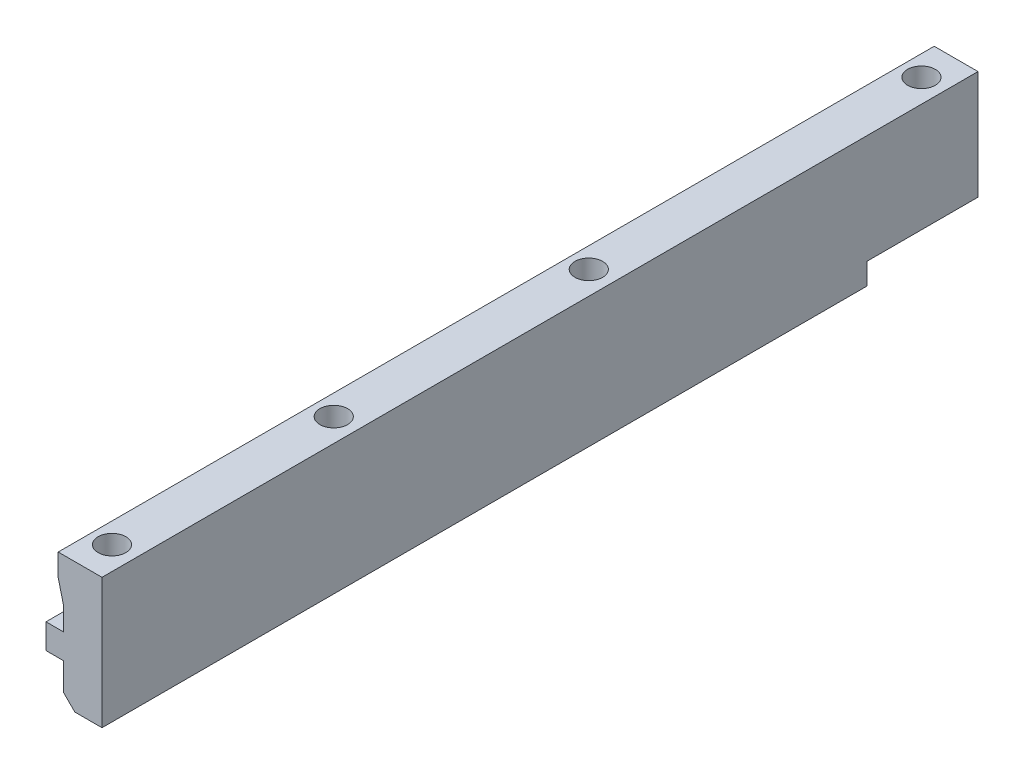
ISO-10303-21;
HEADER;
FILE_DESCRIPTION(('STEP AP214'),'2;1');
FILE_NAME('part.step','',(''),(''),'','','');
FILE_SCHEMA(('AUTOMOTIVE_DESIGN { 1 0 10303 214 1 1 1 1 }'));
ENDSEC;
DATA;
#1=APPLICATION_CONTEXT('core data for automotive mechanical design processes');
#2=APPLICATION_PROTOCOL_DEFINITION('international standard','automotive_design',2000,#1);
#3=PRODUCT_CONTEXT('',#1,'mechanical');
#4=PRODUCT('Part','Part','',(#3));
#5=PRODUCT_RELATED_PRODUCT_CATEGORY('part','',(#4));
#6=PRODUCT_DEFINITION_FORMATION('','',#4);
#7=PRODUCT_DEFINITION_CONTEXT('part definition',#1,'design');
#8=PRODUCT_DEFINITION('design','',#6,#7);
#9=PRODUCT_DEFINITION_SHAPE('','',#8);
#10=(LENGTH_UNIT() NAMED_UNIT(*) SI_UNIT(.MILLI.,.METRE.));
#11=(NAMED_UNIT(*) PLANE_ANGLE_UNIT() SI_UNIT($,.RADIAN.));
#12=(NAMED_UNIT(*) SI_UNIT($,.STERADIAN.) SOLID_ANGLE_UNIT());
#13=UNCERTAINTY_MEASURE_WITH_UNIT(LENGTH_MEASURE(1.E-05),#10,'distance_accuracy_value','');
#14=(GEOMETRIC_REPRESENTATION_CONTEXT(3) GLOBAL_UNCERTAINTY_ASSIGNED_CONTEXT((#13)) GLOBAL_UNIT_ASSIGNED_CONTEXT((#10,
#11,#12)) REPRESENTATION_CONTEXT('',''));
#15=CARTESIAN_POINT('',(0.,0.,0.));
#16=DIRECTION('',(0.,0.,1.));
#17=DIRECTION('',(1.,0.,0.));
#18=AXIS2_PLACEMENT_3D('',#15,#16,#17);
#19=CARTESIAN_POINT('',(0.,0.,0.));
#20=DIRECTION('',(0.,0.,1.));
#21=DIRECTION('',(-1.,0.,0.));
#22=AXIS2_PLACEMENT_3D('',#19,#20,#21);
#23=PLANE('',#22);
#24=DIRECTION('',(0.,-1.,0.));
#25=VECTOR('',#24,1.);
#26=CARTESIAN_POINT('',(-45.4,0.,0.));
#27=LINE('',#26,#25);
#28=CARTESIAN_POINT('',(-45.4,2.25,0.));
#29=VERTEX_POINT('',#28);
#30=CARTESIAN_POINT('',(-45.4,-2.25,0.));
#31=VERTEX_POINT('',#30);
#32=EDGE_CURVE('E210',#29,#31,#27,.T.);
#33=ORIENTED_EDGE('',*,*,#32,.T.);
#34=DIRECTION('',(1.,0.,0.));
#35=VECTOR('',#34,1.);
#36=CARTESIAN_POINT('',(-45.4,-2.25,0.));
#37=LINE('',#36,#35);
#38=CARTESIAN_POINT('',(-48.6,-2.25,0.));
#39=VERTEX_POINT('',#38);
#40=EDGE_CURVE('E201',#39,#31,#37,.T.);
#41=ORIENTED_EDGE('',*,*,#40,.F.);
#42=DIRECTION('',(0.,-1.,0.));
#43=VECTOR('',#42,1.);
#44=CARTESIAN_POINT('',(-48.6,-2.25,0.));
#45=LINE('',#44,#43);
#46=CARTESIAN_POINT('',(-48.6,2.25,0.));
#47=VERTEX_POINT('',#46);
#48=EDGE_CURVE('E198',#47,#39,#45,.T.);
#49=ORIENTED_EDGE('',*,*,#48,.F.);
#50=DIRECTION('',(-1.,0.,0.));
#51=VECTOR('',#50,1.);
#52=CARTESIAN_POINT('',(-48.6,2.25,0.));
#53=LINE('',#52,#51);
#54=EDGE_CURVE('E164',#29,#47,#53,.T.);
#55=ORIENTED_EDGE('',*,*,#54,.F.);
#56=EDGE_LOOP('',(#33,#41,#49,#55));
#57=FACE_BOUND('',#56,.T.);
#58=ADVANCED_FACE('F37',(#57),#23,.F.);
#59=CARTESIAN_POINT('',(-38.5,14.25,138.));
#60=DIRECTION('',(1.,0.,0.));
#61=DIRECTION('',(0.,0.,1.));
#62=AXIS2_PLACEMENT_3D('',#59,#60,#61);
#63=PLANE('',#62);
#64=DIRECTION('',(0.,1.,0.));
#65=VECTOR('',#64,1.);
#66=CARTESIAN_POINT('',(-38.5,14.25,0.));
#67=LINE('',#66,#65);
#68=CARTESIAN_POINT('',(-38.5,-9.25,0.));
#69=VERTEX_POINT('',#68);
#70=CARTESIAN_POINT('',(-38.5,-5.37654590485204,0.));
#71=VERTEX_POINT('',#70);
#72=EDGE_CURVE('E161',#69,#71,#67,.T.);
#73=ORIENTED_EDGE('',*,*,#72,.T.);
#74=DIRECTION('',(0.,0.,1.));
#75=VECTOR('',#74,1.);
#76=CARTESIAN_POINT('',(-38.5,-5.37654590485204,-20.));
#77=LINE('',#76,#75);
#78=CARTESIAN_POINT('',(-38.5,-5.37654590485204,-20.));
#79=VERTEX_POINT('',#78);
#80=EDGE_CURVE('E142',#79,#71,#77,.T.);
#81=ORIENTED_EDGE('',*,*,#80,.F.);
#82=DIRECTION('',(0.,1.,0.));
#83=VECTOR('',#82,1.);
#84=CARTESIAN_POINT('',(-38.5,0.,-20.));
#85=LINE('',#84,#83);
#86=CARTESIAN_POINT('',(-38.5,14.25,-20.));
#87=VERTEX_POINT('',#86);
#88=EDGE_CURVE('E146',#79,#87,#85,.T.);
#89=ORIENTED_EDGE('',*,*,#88,.T.);
#90=DIRECTION('',(0.,0.,-1.));
#91=VECTOR('',#90,1.);
#92=CARTESIAN_POINT('',(-38.5,14.25,138.));
#93=LINE('',#92,#91);
#94=CARTESIAN_POINT('',(-38.5,14.25,138.));
#95=VERTEX_POINT('',#94);
#96=EDGE_CURVE('E194',#95,#87,#93,.T.);
#97=ORIENTED_EDGE('',*,*,#96,.F.);
#98=DIRECTION('',(0.,1.,0.));
#99=VECTOR('',#98,1.);
#100=CARTESIAN_POINT('',(-38.5,14.25,138.));
#101=LINE('',#100,#99);
#102=CARTESIAN_POINT('',(-38.5,-9.25,138.));
#103=VERTEX_POINT('',#102);
#104=EDGE_CURVE('E172',#103,#95,#101,.T.);
#105=ORIENTED_EDGE('',*,*,#104,.F.);
#106=DIRECTION('',(0.,0.,-1.));
#107=VECTOR('',#106,1.);
#108=CARTESIAN_POINT('',(-38.5,-9.25,138.));
#109=LINE('',#108,#107);
#110=EDGE_CURVE('E208',#103,#69,#109,.T.);
#111=ORIENTED_EDGE('',*,*,#110,.T.);
#112=EDGE_LOOP('',(#73,#81,#89,#97,#105,#111));
#113=FACE_BOUND('',#112,.T.);
#114=ADVANCED_FACE('F158',(#113),#63,.T.);
#115=CARTESIAN_POINT('',(-38.5,-9.25,138.));
#116=DIRECTION('',(0.,-1.,0.));
#117=DIRECTION('',(0.,0.,1.));
#118=AXIS2_PLACEMENT_3D('',#115,#116,#117);
#119=PLANE('',#118);
#120=DIRECTION('',(1.,0.,0.));
#121=VECTOR('',#120,1.);
#122=CARTESIAN_POINT('',(-38.5,-9.25,0.));
#123=LINE('',#122,#121);
#124=CARTESIAN_POINT('',(-43.4,-9.25,0.));
#125=VERTEX_POINT('',#124);
#126=EDGE_CURVE('E176',#125,#69,#123,.T.);
#127=ORIENTED_EDGE('',*,*,#126,.T.);
#128=ORIENTED_EDGE('',*,*,#110,.F.);
#129=DIRECTION('',(1.,0.,0.));
#130=VECTOR('',#129,1.);
#131=CARTESIAN_POINT('',(-38.5,-9.25,138.));
#132=LINE('',#131,#130);
#133=CARTESIAN_POINT('',(-43.4,-9.25,138.));
#134=VERTEX_POINT('',#133);
#135=EDGE_CURVE('E193',#134,#103,#132,.T.);
#136=ORIENTED_EDGE('',*,*,#135,.F.);
#137=DIRECTION('',(0.,0.,1.));
#138=VECTOR('',#137,1.);
#139=CARTESIAN_POINT('',(-43.4,-9.25,138.));
#140=LINE('',#139,#138);
#141=EDGE_CURVE('E238',#125,#134,#140,.T.);
#142=ORIENTED_EDGE('',*,*,#141,.F.);
#143=EDGE_LOOP('',(#127,#128,#136,#142));
#144=FACE_BOUND('',#143,.T.);
#145=ADVANCED_FACE('F256',(#144),#119,.T.);
#146=CARTESIAN_POINT('',(-45.4,-9.25,138.));
#147=DIRECTION('',(-1.,0.,0.));
#148=DIRECTION('',(0.,-1.,0.));
#149=AXIS2_PLACEMENT_3D('',#146,#147,#148);
#150=PLANE('',#149);
#151=DIRECTION('',(0.,-1.,0.));
#152=VECTOR('',#151,1.);
#153=CARTESIAN_POINT('',(-45.4,-9.25,0.));
#154=LINE('',#153,#152);
#155=CARTESIAN_POINT('',(-45.4,-3.37654590485205,0.));
#156=VERTEX_POINT('',#155);
#157=CARTESIAN_POINT('',(-45.4,-7.25000000000001,0.));
#158=VERTEX_POINT('',#157);
#159=EDGE_CURVE('E204',#156,#158,#154,.T.);
#160=ORIENTED_EDGE('',*,*,#159,.T.);
#161=DIRECTION('',(0.,0.,-1.));
#162=VECTOR('',#161,1.);
#163=CARTESIAN_POINT('',(-45.4,-7.25000000000001,138.));
#164=LINE('',#163,#162);
#165=CARTESIAN_POINT('',(-45.4,-7.25000000000001,138.));
#166=VERTEX_POINT('',#165);
#167=EDGE_CURVE('E230',#166,#158,#164,.T.);
#168=ORIENTED_EDGE('',*,*,#167,.F.);
#169=DIRECTION('',(0.,-1.,0.));
#170=VECTOR('',#169,1.);
#171=CARTESIAN_POINT('',(-45.4,-9.25,138.));
#172=LINE('',#171,#170);
#173=CARTESIAN_POINT('',(-45.4,-2.25,138.));
#174=VERTEX_POINT('',#173);
#175=EDGE_CURVE('E191',#174,#166,#172,.T.);
#176=ORIENTED_EDGE('',*,*,#175,.F.);
#177=DIRECTION('',(0.,0.,-1.));
#178=VECTOR('',#177,1.);
#179=CARTESIAN_POINT('',(-45.4,-2.25,138.));
#180=LINE('',#179,#178);
#181=EDGE_CURVE('E211',#174,#31,#180,.T.);
#182=ORIENTED_EDGE('',*,*,#181,.T.);
#183=ORIENTED_EDGE('',*,*,#32,.F.);
#184=DIRECTION('',(0.,0.,-1.));
#185=VECTOR('',#184,1.);
#186=CARTESIAN_POINT('',(-45.4,2.25,138.));
#187=LINE('',#186,#185);
#188=CARTESIAN_POINT('',(-45.4,2.25,138.));
#189=VERTEX_POINT('',#188);
#190=EDGE_CURVE('E217',#189,#29,#187,.T.);
#191=ORIENTED_EDGE('',*,*,#190,.F.);
#192=DIRECTION('',(0.,-1.,0.));
#193=VECTOR('',#192,1.);
#194=CARTESIAN_POINT('',(-45.4,2.25,138.));
#195=LINE('',#194,#193);
#196=CARTESIAN_POINT('',(-45.4,6.25,138.));
#197=VERTEX_POINT('',#196);
#198=EDGE_CURVE('E182',#197,#189,#195,.T.);
#199=ORIENTED_EDGE('',*,*,#198,.F.);
#200=DIRECTION('',(0.,0.,-1.));
#201=VECTOR('',#200,1.);
#202=CARTESIAN_POINT('',(-45.4,6.25,138.));
#203=LINE('',#202,#201);
#204=CARTESIAN_POINT('',(-45.4,6.25,-20.));
#205=VERTEX_POINT('',#204);
#206=EDGE_CURVE('E219',#197,#205,#203,.T.);
#207=ORIENTED_EDGE('',*,*,#206,.T.);
#208=DIRECTION('',(0.,-1.,0.));
#209=VECTOR('',#208,1.);
#210=CARTESIAN_POINT('',(-45.4,0.,-20.));
#211=LINE('',#210,#209);
#212=CARTESIAN_POINT('',(-45.4,-3.37654590485205,-20.));
#213=VERTEX_POINT('',#212);
#214=EDGE_CURVE('E147',#205,#213,#211,.T.);
#215=ORIENTED_EDGE('',*,*,#214,.T.);
#216=DIRECTION('',(0.,0.,-1.));
#217=VECTOR('',#216,1.);
#218=CARTESIAN_POINT('',(-45.4,-3.37654590485205,138.));
#219=LINE('',#218,#217);
#220=EDGE_CURVE('E232',#156,#213,#219,.T.);
#221=ORIENTED_EDGE('',*,*,#220,.F.);
#222=EDGE_LOOP('',(#160,#168,#176,#182,#183,#191,#199,#207,#215,#221));
#223=FACE_BOUND('',#222,.T.);
#224=ADVANCED_FACE('F246',(#223),#150,.T.);
#225=CARTESIAN_POINT('',(-45.4,-2.25,138.));
#226=DIRECTION('',(0.,-1.,0.));
#227=DIRECTION('',(0.,0.,1.));
#228=AXIS2_PLACEMENT_3D('',#225,#226,#227);
#229=PLANE('',#228);
#230=ORIENTED_EDGE('',*,*,#40,.T.);
#231=ORIENTED_EDGE('',*,*,#181,.F.);
#232=DIRECTION('',(1.,0.,0.));
#233=VECTOR('',#232,1.);
#234=CARTESIAN_POINT('',(-45.4,-2.25,138.));
#235=LINE('',#234,#233);
#236=CARTESIAN_POINT('',(-48.6,-2.25,138.));
#237=VERTEX_POINT('',#236);
#238=EDGE_CURVE('E189',#237,#174,#235,.T.);
#239=ORIENTED_EDGE('',*,*,#238,.F.);
#240=DIRECTION('',(0.,0.,-1.));
#241=VECTOR('',#240,1.);
#242=CARTESIAN_POINT('',(-48.6,-2.25,138.));
#243=LINE('',#242,#241);
#244=EDGE_CURVE('E213',#237,#39,#243,.T.);
#245=ORIENTED_EDGE('',*,*,#244,.T.);
#246=EDGE_LOOP('',(#230,#231,#239,#245));
#247=FACE_BOUND('',#246,.T.);
#248=ADVANCED_FACE('F286',(#247),#229,.T.);
#249=CARTESIAN_POINT('',(-48.6,-2.25,138.));
#250=DIRECTION('',(-1.,0.,0.));
#251=DIRECTION('',(0.,0.,-1.));
#252=AXIS2_PLACEMENT_3D('',#249,#250,#251);
#253=PLANE('',#252);
#254=ORIENTED_EDGE('',*,*,#48,.T.);
#255=ORIENTED_EDGE('',*,*,#244,.F.);
#256=DIRECTION('',(0.,-1.,0.));
#257=VECTOR('',#256,1.);
#258=CARTESIAN_POINT('',(-48.6,-2.25,138.));
#259=LINE('',#258,#257);
#260=CARTESIAN_POINT('',(-48.6,2.25,138.));
#261=VERTEX_POINT('',#260);
#262=EDGE_CURVE('E187',#261,#237,#259,.T.);
#263=ORIENTED_EDGE('',*,*,#262,.F.);
#264=DIRECTION('',(0.,0.,-1.));
#265=VECTOR('',#264,1.);
#266=CARTESIAN_POINT('',(-48.6,2.25,138.));
#267=LINE('',#266,#265);
#268=EDGE_CURVE('E215',#261,#47,#267,.T.);
#269=ORIENTED_EDGE('',*,*,#268,.T.);
#270=EDGE_LOOP('',(#254,#255,#263,#269));
#271=FACE_BOUND('',#270,.T.);
#272=ADVANCED_FACE('F283',(#271),#253,.T.);
#273=CARTESIAN_POINT('',(-48.6,2.25,138.));
#274=DIRECTION('',(0.,1.,0.));
#275=DIRECTION('',(0.,0.,-1.));
#276=AXIS2_PLACEMENT_3D('',#273,#274,#275);
#277=PLANE('',#276);
#278=ORIENTED_EDGE('',*,*,#54,.T.);
#279=ORIENTED_EDGE('',*,*,#268,.F.);
#280=DIRECTION('',(-1.,0.,0.));
#281=VECTOR('',#280,1.);
#282=CARTESIAN_POINT('',(-48.6,2.25,138.));
#283=LINE('',#282,#281);
#284=EDGE_CURVE('E185',#189,#261,#283,.T.);
#285=ORIENTED_EDGE('',*,*,#284,.F.);
#286=ORIENTED_EDGE('',*,*,#190,.T.);
#287=EDGE_LOOP('',(#278,#279,#285,#286));
#288=FACE_BOUND('',#287,.T.);
#289=ADVANCED_FACE('F277',(#288),#277,.T.);
#290=CARTESIAN_POINT('',(-46.4,10.25,138.));
#291=DIRECTION('',(-0.970142500145332,-0.242535625036333,0.));
#292=DIRECTION('',(0.242535625036333,-0.970142500145332,0.));
#293=AXIS2_PLACEMENT_3D('',#290,#291,#292);
#294=PLANE('',#293);
#295=ORIENTED_EDGE('',*,*,#206,.F.);
#296=DIRECTION('',(0.242535625036333,-0.970142500145332,0.));
#297=VECTOR('',#296,1.);
#298=CARTESIAN_POINT('',(-46.4,10.25,138.));
#299=LINE('',#298,#297);
#300=CARTESIAN_POINT('',(-46.4,10.25,138.));
#301=VERTEX_POINT('',#300);
#302=EDGE_CURVE('E180',#301,#197,#299,.T.);
#303=ORIENTED_EDGE('',*,*,#302,.F.);
#304=DIRECTION('',(0.,0.,-1.));
#305=VECTOR('',#304,1.);
#306=CARTESIAN_POINT('',(-46.4,10.25,138.));
#307=LINE('',#306,#305);
#308=CARTESIAN_POINT('',(-46.4,10.25,-20.));
#309=VERTEX_POINT('',#308);
#310=EDGE_CURVE('E222',#301,#309,#307,.T.);
#311=ORIENTED_EDGE('',*,*,#310,.T.);
#312=DIRECTION('',(0.242535625036333,-0.970142500145332,0.));
#313=VECTOR('',#312,1.);
#314=CARTESIAN_POINT('',(-41.2588235294118,-10.3147058823529,-20.));
#315=LINE('',#314,#313);
#316=EDGE_CURVE('E162',#309,#205,#315,.T.);
#317=ORIENTED_EDGE('',*,*,#316,.T.);
#318=EDGE_LOOP('',(#295,#303,#311,#317));
#319=FACE_BOUND('',#318,.T.);
#320=ADVANCED_FACE('F269',(#319),#294,.T.);
#321=CARTESIAN_POINT('',(-46.4,14.25,138.));
#322=DIRECTION('',(-1.,0.,0.));
#323=DIRECTION('',(0.,0.,-1.));
#324=AXIS2_PLACEMENT_3D('',#321,#322,#323);
#325=PLANE('',#324);
#326=ORIENTED_EDGE('',*,*,#310,.F.);
#327=DIRECTION('',(0.,-1.,0.));
#328=VECTOR('',#327,1.);
#329=CARTESIAN_POINT('',(-46.4,14.25,138.));
#330=LINE('',#329,#328);
#331=CARTESIAN_POINT('',(-46.4,14.25,138.));
#332=VERTEX_POINT('',#331);
#333=EDGE_CURVE('E178',#332,#301,#330,.T.);
#334=ORIENTED_EDGE('',*,*,#333,.F.);
#335=DIRECTION('',(0.,0.,-1.));
#336=VECTOR('',#335,1.);
#337=CARTESIAN_POINT('',(-46.4,14.25,138.));
#338=LINE('',#337,#336);
#339=CARTESIAN_POINT('',(-46.4,14.25,-20.));
#340=VERTEX_POINT('',#339);
#341=EDGE_CURVE('E225',#332,#340,#338,.T.);
#342=ORIENTED_EDGE('',*,*,#341,.T.);
#343=DIRECTION('',(0.,-1.,0.));
#344=VECTOR('',#343,1.);
#345=CARTESIAN_POINT('',(-46.4,0.,-20.));
#346=LINE('',#345,#344);
#347=EDGE_CURVE('E166',#340,#309,#346,.T.);
#348=ORIENTED_EDGE('',*,*,#347,.T.);
#349=EDGE_LOOP('',(#326,#334,#342,#348));
#350=FACE_BOUND('',#349,.T.);
#351=ADVANCED_FACE('F264',(#350),#325,.T.);
#352=CARTESIAN_POINT('',(-45.4,14.25,138.));
#353=DIRECTION('',(0.,1.,0.));
#354=DIRECTION('',(0.,0.,-1.));
#355=AXIS2_PLACEMENT_3D('',#352,#353,#354);
#356=PLANE('',#355);
#357=CARTESIAN_POINT('',(-42.7,14.25,132.));
#358=DIRECTION('',(0.,-1.,0.));
#359=DIRECTION('',(0.,0.,-1.));
#360=AXIS2_PLACEMENT_3D('',#357,#358,#359);
#361=CIRCLE('',#360,2.5);
#362=CARTESIAN_POINT('',(-42.7,14.25,129.5));
#363=VERTEX_POINT('',#362);
#364=EDGE_CURVE('E391',#363,#363,#361,.T.);
#365=ORIENTED_EDGE('',*,*,#364,.T.);
#366=EDGE_LOOP('',(#365));
#367=FACE_BOUND('',#366,.T.);
#368=CARTESIAN_POINT('',(-42.7,14.25,92.));
#369=DIRECTION('',(0.,-1.,0.));
#370=DIRECTION('',(0.,0.,-1.));
#371=AXIS2_PLACEMENT_3D('',#368,#369,#370);
#372=CIRCLE('',#371,2.5);
#373=CARTESIAN_POINT('',(-42.7,14.25,89.5));
#374=VERTEX_POINT('',#373);
#375=EDGE_CURVE('E401',#374,#374,#372,.T.);
#376=ORIENTED_EDGE('',*,*,#375,.T.);
#377=EDGE_LOOP('',(#376));
#378=FACE_BOUND('',#377,.T.);
#379=CARTESIAN_POINT('',(-42.7,14.25,46.));
#380=DIRECTION('',(0.,-1.,0.));
#381=DIRECTION('',(0.,0.,-1.));
#382=AXIS2_PLACEMENT_3D('',#379,#380,#381);
#383=CIRCLE('',#382,2.5);
#384=CARTESIAN_POINT('',(-42.7,14.25,43.5));
#385=VERTEX_POINT('',#384);
#386=EDGE_CURVE('E413',#385,#385,#383,.T.);
#387=ORIENTED_EDGE('',*,*,#386,.T.);
#388=EDGE_LOOP('',(#387));
#389=FACE_BOUND('',#388,.T.);
#390=CARTESIAN_POINT('',(-42.7,14.25,-14.));
#391=DIRECTION('',(0.,-1.,0.));
#392=DIRECTION('',(0.,0.,-1.));
#393=AXIS2_PLACEMENT_3D('',#390,#391,#392);
#394=CIRCLE('',#393,2.5);
#395=CARTESIAN_POINT('',(-42.7,14.25,-16.5));
#396=VERTEX_POINT('',#395);
#397=EDGE_CURVE('E425',#396,#396,#394,.T.);
#398=ORIENTED_EDGE('',*,*,#397,.T.);
#399=EDGE_LOOP('',(#398));
#400=FACE_BOUND('',#399,.T.);
#401=ORIENTED_EDGE('',*,*,#341,.F.);
#402=DIRECTION('',(-1.,0.,0.));
#403=VECTOR('',#402,1.);
#404=CARTESIAN_POINT('',(-45.4,14.25,138.));
#405=LINE('',#404,#403);
#406=EDGE_CURVE('E175',#95,#332,#405,.T.);
#407=ORIENTED_EDGE('',*,*,#406,.F.);
#408=ORIENTED_EDGE('',*,*,#96,.T.);
#409=DIRECTION('',(-1.,0.,0.));
#410=VECTOR('',#409,1.);
#411=CARTESIAN_POINT('',(0.,14.25,-20.));
#412=LINE('',#411,#410);
#413=EDGE_CURVE('E153',#87,#340,#412,.T.);
#414=ORIENTED_EDGE('',*,*,#413,.T.);
#415=EDGE_LOOP('',(#401,#407,#408,#414));
#416=FACE_BOUND('',#415,.T.);
#417=ADVANCED_FACE('F262',(#367,#378,#389,#400,#416),#356,.T.);
#418=CARTESIAN_POINT('',(0.,0.,138.));
#419=DIRECTION('',(0.,0.,1.));
#420=DIRECTION('',(-1.,0.,0.));
#421=AXIS2_PLACEMENT_3D('',#418,#419,#420);
#422=PLANE('',#421);
#423=ORIENTED_EDGE('',*,*,#135,.T.);
#424=ORIENTED_EDGE('',*,*,#104,.T.);
#425=ORIENTED_EDGE('',*,*,#406,.T.);
#426=ORIENTED_EDGE('',*,*,#333,.T.);
#427=ORIENTED_EDGE('',*,*,#302,.T.);
#428=ORIENTED_EDGE('',*,*,#198,.T.);
#429=ORIENTED_EDGE('',*,*,#284,.T.);
#430=ORIENTED_EDGE('',*,*,#262,.T.);
#431=ORIENTED_EDGE('',*,*,#238,.T.);
#432=ORIENTED_EDGE('',*,*,#175,.T.);
#433=DIRECTION('',(0.707106781186548,-0.707106781186548,0.));
#434=VECTOR('',#433,1.);
#435=CARTESIAN_POINT('',(-26.325,-26.325,138.));
#436=LINE('',#435,#434);
#437=EDGE_CURVE('E45',#134,#166,#436,.F.);
#438=ORIENTED_EDGE('',*,*,#437,.F.);
#439=EDGE_LOOP('',(#423,#424,#425,#426,#427,#428,#429,#430,#431,#432,#438));
#440=FACE_BOUND('',#439,.T.);
#441=ADVANCED_FACE('F242',(#440),#422,.T.);
#442=ORIENTED_EDGE('',*,*,#159,.F.);
#443=DIRECTION('',(0.707106781186548,-0.707106781186548,0.));
#444=VECTOR('',#443,1.);
#445=CARTESIAN_POINT('',(-24.388272952426,-24.388272952426,0.));
#446=LINE('',#445,#444);
#447=CARTESIAN_POINT('',(-43.4,-5.37654590485204,0.));
#448=VERTEX_POINT('',#447);
#449=EDGE_CURVE('E11',#448,#156,#446,.F.);
#450=ORIENTED_EDGE('',*,*,#449,.F.);
#451=DIRECTION('',(-1.,0.,0.));
#452=VECTOR('',#451,1.);
#453=CARTESIAN_POINT('',(0.,-5.37654590485204,0.));
#454=LINE('',#453,#452);
#455=EDGE_CURVE('E170',#71,#448,#454,.T.);
#456=ORIENTED_EDGE('',*,*,#455,.F.);
#457=ORIENTED_EDGE('',*,*,#72,.F.);
#458=ORIENTED_EDGE('',*,*,#126,.F.);
#459=DIRECTION('',(-0.707106781186548,0.707106781186548,0.));
#460=VECTOR('',#459,1.);
#461=CARTESIAN_POINT('',(-45.4,-7.25000000000001,0.));
#462=LINE('',#461,#460);
#463=EDGE_CURVE('E58',#158,#125,#462,.F.);
#464=ORIENTED_EDGE('',*,*,#463,.F.);
#465=EDGE_LOOP('',(#442,#450,#456,#457,#458,#464));
#466=FACE_BOUND('',#465,.T.);
#467=ADVANCED_FACE('F252',(#466),#23,.F.);
#468=CARTESIAN_POINT('',(0.,-5.37654590485204,-20.));
#469=DIRECTION('',(0.,-1.,0.));
#470=DIRECTION('',(0.,0.,1.));
#471=AXIS2_PLACEMENT_3D('',#468,#469,#470);
#472=PLANE('',#471);
#473=DIRECTION('',(-1.,0.,0.));
#474=VECTOR('',#473,1.);
#475=CARTESIAN_POINT('',(0.,-5.37654590485204,-20.));
#476=LINE('',#475,#474);
#477=CARTESIAN_POINT('',(-43.4,-5.37654590485204,-20.));
#478=VERTEX_POINT('',#477);
#479=EDGE_CURVE('E137',#79,#478,#476,.T.);
#480=ORIENTED_EDGE('',*,*,#479,.F.);
#481=ORIENTED_EDGE('',*,*,#80,.T.);
#482=ORIENTED_EDGE('',*,*,#455,.T.);
#483=DIRECTION('',(0.,0.,1.));
#484=VECTOR('',#483,1.);
#485=CARTESIAN_POINT('',(-43.4,-5.37654590485204,-20.));
#486=LINE('',#485,#484);
#487=EDGE_CURVE('E144',#478,#448,#486,.T.);
#488=ORIENTED_EDGE('',*,*,#487,.F.);
#489=EDGE_LOOP('',(#480,#481,#482,#488));
#490=FACE_BOUND('',#489,.T.);
#491=ADVANCED_FACE('F139',(#490),#472,.T.);
#492=CARTESIAN_POINT('',(0.,0.,-20.));
#493=DIRECTION('',(0.,0.,-1.));
#494=DIRECTION('',(1.,0.,0.));
#495=AXIS2_PLACEMENT_3D('',#492,#493,#494);
#496=PLANE('',#495);
#497=ORIENTED_EDGE('',*,*,#214,.F.);
#498=ORIENTED_EDGE('',*,*,#316,.F.);
#499=ORIENTED_EDGE('',*,*,#347,.F.);
#500=ORIENTED_EDGE('',*,*,#413,.F.);
#501=ORIENTED_EDGE('',*,*,#88,.F.);
#502=ORIENTED_EDGE('',*,*,#479,.T.);
#503=DIRECTION('',(-0.707106781186548,0.707106781186548,0.));
#504=VECTOR('',#503,1.);
#505=CARTESIAN_POINT('',(-24.388272952426,-24.388272952426,-20.));
#506=LINE('',#505,#504);
#507=EDGE_CURVE('E235',#213,#478,#506,.F.);
#508=ORIENTED_EDGE('',*,*,#507,.F.);
#509=EDGE_LOOP('',(#497,#498,#499,#500,#501,#502,#508));
#510=FACE_BOUND('',#509,.T.);
#511=ADVANCED_FACE('F151',(#510),#496,.T.);
#512=CARTESIAN_POINT('',(-42.7,-0.749999999999999,-14.));
#513=DIRECTION('',(0.,-1.,0.));
#514=DIRECTION('',(0.,0.,1.));
#515=AXIS2_PLACEMENT_3D('',#512,#513,#514);
#516=PLANE('',#515);
#517=CARTESIAN_POINT('',(-42.7,-0.749999999999999,-14.));
#518=DIRECTION('',(0.,-1.,0.));
#519=DIRECTION('',(0.,0.,-1.));
#520=AXIS2_PLACEMENT_3D('',#517,#518,#519);
#521=CIRCLE('',#520,1.6);
#522=CARTESIAN_POINT('',(-42.7,-0.749999999999999,-15.6));
#523=VERTEX_POINT('',#522);
#524=EDGE_CURVE('E434',#523,#523,#521,.T.);
#525=ORIENTED_EDGE('',*,*,#524,.F.);
#526=EDGE_LOOP('',(#525));
#527=FACE_BOUND('',#526,.T.);
#528=ADVANCED_FACE('F317',(#527),#516,.F.);
#529=CARTESIAN_POINT('',(-42.7,14.25,-14.));
#530=DIRECTION('',(0.,1.,0.));
#531=DIRECTION('',(0.,0.,-1.));
#532=AXIS2_PLACEMENT_3D('',#529,#530,#531);
#533=CYLINDRICAL_SURFACE('',#532,1.6);
#534=ORIENTED_EDGE('',*,*,#524,.T.);
#535=EDGE_LOOP('',(#534));
#536=FACE_BOUND('',#535,.T.);
#537=CARTESIAN_POINT('',(-42.7,9.25,-14.));
#538=DIRECTION('',(0.,-1.,0.));
#539=DIRECTION('',(0.,0.,-1.));
#540=AXIS2_PLACEMENT_3D('',#537,#538,#539);
#541=CIRCLE('',#540,1.6);
#542=CARTESIAN_POINT('',(-42.7,9.25,-15.6));
#543=VERTEX_POINT('',#542);
#544=EDGE_CURVE('E431',#543,#543,#541,.T.);
#545=ORIENTED_EDGE('',*,*,#544,.F.);
#546=EDGE_LOOP('',(#545));
#547=FACE_BOUND('',#546,.T.);
#548=ADVANCED_FACE('F320',(#536,#547),#533,.F.);
#549=CARTESIAN_POINT('',(-41.1,9.25,-14.));
#550=DIRECTION('',(0.,-1.,0.));
#551=DIRECTION('',(0.,0.,1.));
#552=AXIS2_PLACEMENT_3D('',#549,#550,#551);
#553=PLANE('',#552);
#554=ORIENTED_EDGE('',*,*,#544,.T.);
#555=EDGE_LOOP('',(#554));
#556=FACE_BOUND('',#555,.T.);
#557=CARTESIAN_POINT('',(-42.7,9.25,-14.));
#558=DIRECTION('',(0.,-1.,0.));
#559=DIRECTION('',(0.,0.,-1.));
#560=AXIS2_PLACEMENT_3D('',#557,#558,#559);
#561=CIRCLE('',#560,2.5);
#562=CARTESIAN_POINT('',(-42.7,9.25,-16.5));
#563=VERTEX_POINT('',#562);
#564=EDGE_CURVE('E428',#563,#563,#561,.T.);
#565=ORIENTED_EDGE('',*,*,#564,.F.);
#566=EDGE_LOOP('',(#565));
#567=FACE_BOUND('',#566,.T.);
#568=ADVANCED_FACE('F324',(#556,#567),#553,.F.);
#569=CARTESIAN_POINT('',(-42.7,14.25,-14.));
#570=DIRECTION('',(0.,1.,0.));
#571=DIRECTION('',(0.,0.,-1.));
#572=AXIS2_PLACEMENT_3D('',#569,#570,#571);
#573=CYLINDRICAL_SURFACE('',#572,2.5);
#574=ORIENTED_EDGE('',*,*,#564,.T.);
#575=EDGE_LOOP('',(#574));
#576=FACE_BOUND('',#575,.T.);
#577=ORIENTED_EDGE('',*,*,#397,.F.);
#578=EDGE_LOOP('',(#577));
#579=FACE_BOUND('',#578,.T.);
#580=ADVANCED_FACE('F328',(#576,#579),#573,.F.);
#581=CARTESIAN_POINT('',(-42.7,-0.749999999999999,46.));
#582=DIRECTION('',(0.,-1.,0.));
#583=DIRECTION('',(0.,0.,1.));
#584=AXIS2_PLACEMENT_3D('',#581,#582,#583);
#585=PLANE('',#584);
#586=CARTESIAN_POINT('',(-42.7,-0.749999999999999,46.));
#587=DIRECTION('',(0.,-1.,0.));
#588=DIRECTION('',(0.,0.,-1.));
#589=AXIS2_PLACEMENT_3D('',#586,#587,#588);
#590=CIRCLE('',#589,1.6);
#591=CARTESIAN_POINT('',(-42.7,-0.749999999999999,44.4));
#592=VERTEX_POINT('',#591);
#593=EDGE_CURVE('E422',#592,#592,#590,.T.);
#594=ORIENTED_EDGE('',*,*,#593,.F.);
#595=EDGE_LOOP('',(#594));
#596=FACE_BOUND('',#595,.T.);
#597=ADVANCED_FACE('F332',(#596),#585,.F.);
#598=CARTESIAN_POINT('',(-42.7,14.25,46.));
#599=DIRECTION('',(0.,1.,0.));
#600=DIRECTION('',(0.,0.,-1.));
#601=AXIS2_PLACEMENT_3D('',#598,#599,#600);
#602=CYLINDRICAL_SURFACE('',#601,1.6);
#603=ORIENTED_EDGE('',*,*,#593,.T.);
#604=EDGE_LOOP('',(#603));
#605=FACE_BOUND('',#604,.T.);
#606=CARTESIAN_POINT('',(-42.7,9.25,46.));
#607=DIRECTION('',(0.,-1.,0.));
#608=DIRECTION('',(0.,0.,-1.));
#609=AXIS2_PLACEMENT_3D('',#606,#607,#608);
#610=CIRCLE('',#609,1.6);
#611=CARTESIAN_POINT('',(-42.7,9.25,44.4));
#612=VERTEX_POINT('',#611);
#613=EDGE_CURVE('E419',#612,#612,#610,.T.);
#614=ORIENTED_EDGE('',*,*,#613,.F.);
#615=EDGE_LOOP('',(#614));
#616=FACE_BOUND('',#615,.T.);
#617=ADVANCED_FACE('F336',(#605,#616),#602,.F.);
#618=CARTESIAN_POINT('',(-41.1,9.25,46.));
#619=DIRECTION('',(0.,-1.,0.));
#620=DIRECTION('',(0.,0.,1.));
#621=AXIS2_PLACEMENT_3D('',#618,#619,#620);
#622=PLANE('',#621);
#623=ORIENTED_EDGE('',*,*,#613,.T.);
#624=EDGE_LOOP('',(#623));
#625=FACE_BOUND('',#624,.T.);
#626=CARTESIAN_POINT('',(-42.7,9.25,46.));
#627=DIRECTION('',(0.,-1.,0.));
#628=DIRECTION('',(0.,0.,-1.));
#629=AXIS2_PLACEMENT_3D('',#626,#627,#628);
#630=CIRCLE('',#629,2.5);
#631=CARTESIAN_POINT('',(-42.7,9.25,43.5));
#632=VERTEX_POINT('',#631);
#633=EDGE_CURVE('E416',#632,#632,#630,.T.);
#634=ORIENTED_EDGE('',*,*,#633,.F.);
#635=EDGE_LOOP('',(#634));
#636=FACE_BOUND('',#635,.T.);
#637=ADVANCED_FACE('F340',(#625,#636),#622,.F.);
#638=CARTESIAN_POINT('',(-42.7,14.25,46.));
#639=DIRECTION('',(0.,1.,0.));
#640=DIRECTION('',(0.,0.,-1.));
#641=AXIS2_PLACEMENT_3D('',#638,#639,#640);
#642=CYLINDRICAL_SURFACE('',#641,2.5);
#643=ORIENTED_EDGE('',*,*,#633,.T.);
#644=EDGE_LOOP('',(#643));
#645=FACE_BOUND('',#644,.T.);
#646=ORIENTED_EDGE('',*,*,#386,.F.);
#647=EDGE_LOOP('',(#646));
#648=FACE_BOUND('',#647,.T.);
#649=ADVANCED_FACE('F344',(#645,#648),#642,.F.);
#650=CARTESIAN_POINT('',(-42.7,-0.749999999999999,92.));
#651=DIRECTION('',(0.,-1.,0.));
#652=DIRECTION('',(0.,0.,1.));
#653=AXIS2_PLACEMENT_3D('',#650,#651,#652);
#654=PLANE('',#653);
#655=CARTESIAN_POINT('',(-42.7,-0.749999999999999,92.));
#656=DIRECTION('',(0.,-1.,0.));
#657=DIRECTION('',(0.,0.,-1.));
#658=AXIS2_PLACEMENT_3D('',#655,#656,#657);
#659=CIRCLE('',#658,1.6);
#660=CARTESIAN_POINT('',(-42.7,-0.749999999999999,90.4));
#661=VERTEX_POINT('',#660);
#662=EDGE_CURVE('E410',#661,#661,#659,.T.);
#663=ORIENTED_EDGE('',*,*,#662,.F.);
#664=EDGE_LOOP('',(#663));
#665=FACE_BOUND('',#664,.T.);
#666=ADVANCED_FACE('F348',(#665),#654,.F.);
#667=CARTESIAN_POINT('',(-42.7,14.25,92.));
#668=DIRECTION('',(0.,1.,0.));
#669=DIRECTION('',(0.,0.,-1.));
#670=AXIS2_PLACEMENT_3D('',#667,#668,#669);
#671=CYLINDRICAL_SURFACE('',#670,1.6);
#672=ORIENTED_EDGE('',*,*,#662,.T.);
#673=EDGE_LOOP('',(#672));
#674=FACE_BOUND('',#673,.T.);
#675=CARTESIAN_POINT('',(-42.7,9.25,92.));
#676=DIRECTION('',(0.,-1.,0.));
#677=DIRECTION('',(0.,0.,-1.));
#678=AXIS2_PLACEMENT_3D('',#675,#676,#677);
#679=CIRCLE('',#678,1.6);
#680=CARTESIAN_POINT('',(-42.7,9.25,90.4));
#681=VERTEX_POINT('',#680);
#682=EDGE_CURVE('E407',#681,#681,#679,.T.);
#683=ORIENTED_EDGE('',*,*,#682,.F.);
#684=EDGE_LOOP('',(#683));
#685=FACE_BOUND('',#684,.T.);
#686=ADVANCED_FACE('F352',(#674,#685),#671,.F.);
#687=CARTESIAN_POINT('',(-41.1,9.25,92.));
#688=DIRECTION('',(0.,-1.,0.));
#689=DIRECTION('',(0.,0.,1.));
#690=AXIS2_PLACEMENT_3D('',#687,#688,#689);
#691=PLANE('',#690);
#692=ORIENTED_EDGE('',*,*,#682,.T.);
#693=EDGE_LOOP('',(#692));
#694=FACE_BOUND('',#693,.T.);
#695=CARTESIAN_POINT('',(-42.7,9.25,92.));
#696=DIRECTION('',(0.,-1.,0.));
#697=DIRECTION('',(0.,0.,-1.));
#698=AXIS2_PLACEMENT_3D('',#695,#696,#697);
#699=CIRCLE('',#698,2.5);
#700=CARTESIAN_POINT('',(-42.7,9.25,89.5));
#701=VERTEX_POINT('',#700);
#702=EDGE_CURVE('E404',#701,#701,#699,.T.);
#703=ORIENTED_EDGE('',*,*,#702,.F.);
#704=EDGE_LOOP('',(#703));
#705=FACE_BOUND('',#704,.T.);
#706=ADVANCED_FACE('F356',(#694,#705),#691,.F.);
#707=CARTESIAN_POINT('',(-42.7,14.25,92.));
#708=DIRECTION('',(0.,1.,0.));
#709=DIRECTION('',(0.,0.,-1.));
#710=AXIS2_PLACEMENT_3D('',#707,#708,#709);
#711=CYLINDRICAL_SURFACE('',#710,2.5);
#712=ORIENTED_EDGE('',*,*,#702,.T.);
#713=EDGE_LOOP('',(#712));
#714=FACE_BOUND('',#713,.T.);
#715=ORIENTED_EDGE('',*,*,#375,.F.);
#716=EDGE_LOOP('',(#715));
#717=FACE_BOUND('',#716,.T.);
#718=ADVANCED_FACE('F360',(#714,#717),#711,.F.);
#719=CARTESIAN_POINT('',(-42.7,-0.749999999999999,132.));
#720=DIRECTION('',(0.,-1.,0.));
#721=DIRECTION('',(0.,0.,1.));
#722=AXIS2_PLACEMENT_3D('',#719,#720,#721);
#723=PLANE('',#722);
#724=CARTESIAN_POINT('',(-42.7,-0.749999999999999,132.));
#725=DIRECTION('',(0.,-1.,0.));
#726=DIRECTION('',(0.,0.,-1.));
#727=AXIS2_PLACEMENT_3D('',#724,#725,#726);
#728=CIRCLE('',#727,1.6);
#729=CARTESIAN_POINT('',(-42.7,-0.749999999999999,130.4));
#730=VERTEX_POINT('',#729);
#731=EDGE_CURVE('E398',#730,#730,#728,.T.);
#732=ORIENTED_EDGE('',*,*,#731,.F.);
#733=EDGE_LOOP('',(#732));
#734=FACE_BOUND('',#733,.T.);
#735=ADVANCED_FACE('F364',(#734),#723,.F.);
#736=CARTESIAN_POINT('',(-42.7,14.25,132.));
#737=DIRECTION('',(0.,1.,0.));
#738=DIRECTION('',(0.,0.,-1.));
#739=AXIS2_PLACEMENT_3D('',#736,#737,#738);
#740=CYLINDRICAL_SURFACE('',#739,1.6);
#741=ORIENTED_EDGE('',*,*,#731,.T.);
#742=EDGE_LOOP('',(#741));
#743=FACE_BOUND('',#742,.T.);
#744=CARTESIAN_POINT('',(-42.7,9.25,132.));
#745=DIRECTION('',(0.,-1.,0.));
#746=DIRECTION('',(0.,0.,-1.));
#747=AXIS2_PLACEMENT_3D('',#744,#745,#746);
#748=CIRCLE('',#747,1.6);
#749=CARTESIAN_POINT('',(-42.7,9.25,130.4));
#750=VERTEX_POINT('',#749);
#751=EDGE_CURVE('E393',#750,#750,#748,.T.);
#752=ORIENTED_EDGE('',*,*,#751,.F.);
#753=EDGE_LOOP('',(#752));
#754=FACE_BOUND('',#753,.T.);
#755=ADVANCED_FACE('F368',(#743,#754),#740,.F.);
#756=CARTESIAN_POINT('',(-41.1,9.25,132.));
#757=DIRECTION('',(0.,-1.,0.));
#758=DIRECTION('',(0.,0.,1.));
#759=AXIS2_PLACEMENT_3D('',#756,#757,#758);
#760=PLANE('',#759);
#761=ORIENTED_EDGE('',*,*,#751,.T.);
#762=EDGE_LOOP('',(#761));
#763=FACE_BOUND('',#762,.T.);
#764=CARTESIAN_POINT('',(-42.7,9.25,132.));
#765=DIRECTION('',(0.,-1.,0.));
#766=DIRECTION('',(0.,0.,-1.));
#767=AXIS2_PLACEMENT_3D('',#764,#765,#766);
#768=CIRCLE('',#767,2.5);
#769=CARTESIAN_POINT('',(-42.7,9.25,129.5));
#770=VERTEX_POINT('',#769);
#771=EDGE_CURVE('E388',#770,#770,#768,.T.);
#772=ORIENTED_EDGE('',*,*,#771,.F.);
#773=EDGE_LOOP('',(#772));
#774=FACE_BOUND('',#773,.T.);
#775=ADVANCED_FACE('F372',(#763,#774),#760,.F.);
#776=CARTESIAN_POINT('',(-42.7,14.25,132.));
#777=DIRECTION('',(0.,1.,0.));
#778=DIRECTION('',(0.,0.,-1.));
#779=AXIS2_PLACEMENT_3D('',#776,#777,#778);
#780=CYLINDRICAL_SURFACE('',#779,2.5);
#781=ORIENTED_EDGE('',*,*,#771,.T.);
#782=EDGE_LOOP('',(#781));
#783=FACE_BOUND('',#782,.T.);
#784=ORIENTED_EDGE('',*,*,#364,.F.);
#785=EDGE_LOOP('',(#784));
#786=FACE_BOUND('',#785,.T.);
#787=ADVANCED_FACE('F376',(#783,#786),#780,.F.);
#788=CARTESIAN_POINT('',(-43.4,-5.37654590485204,-20.));
#789=DIRECTION('',(0.707106781186547,0.707106781186547,0.));
#790=DIRECTION('',(0.,0.,1.));
#791=AXIS2_PLACEMENT_3D('',#788,#789,#790);
#792=PLANE('',#791);
#793=ORIENTED_EDGE('',*,*,#507,.T.);
#794=ORIENTED_EDGE('',*,*,#487,.T.);
#795=ORIENTED_EDGE('',*,*,#449,.T.);
#796=ORIENTED_EDGE('',*,*,#220,.T.);
#797=EDGE_LOOP('',(#793,#794,#795,#796));
#798=FACE_BOUND('',#797,.T.);
#799=ADVANCED_FACE('F379',(#798),#792,.F.);
#800=CARTESIAN_POINT('',(-45.4,-7.25000000000001,138.));
#801=DIRECTION('',(0.707106781186547,0.707106781186547,0.));
#802=DIRECTION('',(0.,0.,-1.));
#803=AXIS2_PLACEMENT_3D('',#800,#801,#802);
#804=PLANE('',#803);
#805=ORIENTED_EDGE('',*,*,#437,.T.);
#806=ORIENTED_EDGE('',*,*,#167,.T.);
#807=ORIENTED_EDGE('',*,*,#463,.T.);
#808=ORIENTED_EDGE('',*,*,#141,.T.);
#809=EDGE_LOOP('',(#805,#806,#807,#808));
#810=FACE_BOUND('',#809,.T.);
#811=ADVANCED_FACE('F39',(#810),#804,.F.);
#812=CLOSED_SHELL('',(#58,#114,#145,#224,#248,#272,#289,#320,#351,#417,#441,#467,#491,#511,#528,
#548,#568,#580,#597,#617,#637,#649,#666,#686,#706,#718,#735,#755,#775,#787,#799,#811));
#813=MANIFOLD_SOLID_BREP('B2',#812);
#814=ADVANCED_BREP_SHAPE_REPRESENTATION('',(#18,#813),#14);
#815=SHAPE_DEFINITION_REPRESENTATION(#9,#814);
ENDSEC;
END-ISO-10303-21;
